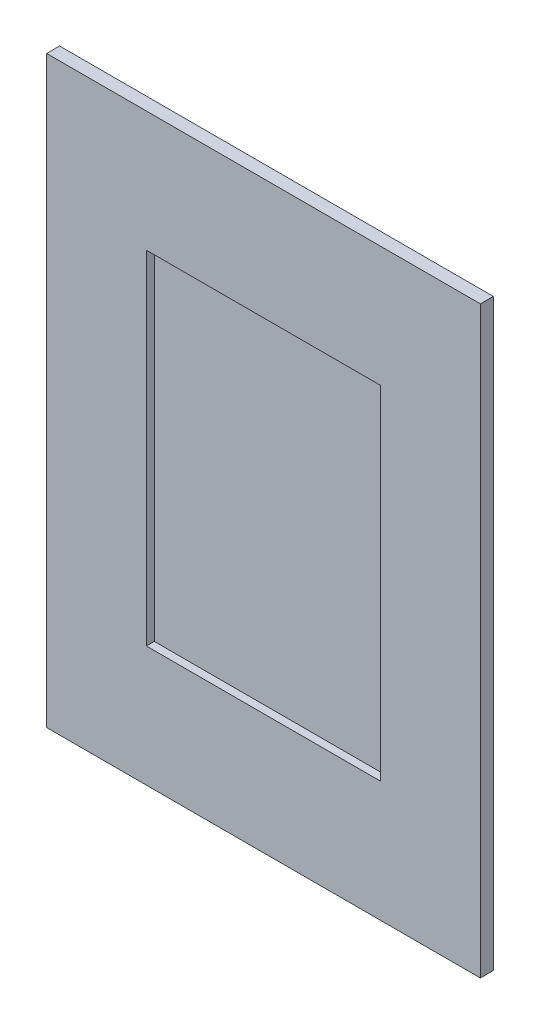
ISO-10303-21;
HEADER;
FILE_DESCRIPTION(('STEP AP214'),'2;1');
FILE_NAME('part.step','',(''),(''),'','','');
FILE_SCHEMA(('AUTOMOTIVE_DESIGN { 1 0 10303 214 1 1 1 1 }'));
ENDSEC;
DATA;
#1=APPLICATION_CONTEXT('core data for automotive mechanical design processes');
#2=APPLICATION_PROTOCOL_DEFINITION('international standard','automotive_design',2000,#1);
#3=PRODUCT_CONTEXT('',#1,'mechanical');
#4=PRODUCT('Part','Part','',(#3));
#5=PRODUCT_RELATED_PRODUCT_CATEGORY('part','',(#4));
#6=PRODUCT_DEFINITION_FORMATION('','',#4);
#7=PRODUCT_DEFINITION_CONTEXT('part definition',#1,'design');
#8=PRODUCT_DEFINITION('design','',#6,#7);
#9=PRODUCT_DEFINITION_SHAPE('','',#8);
#10=(LENGTH_UNIT() NAMED_UNIT(*) SI_UNIT(.MILLI.,.METRE.));
#11=(NAMED_UNIT(*) PLANE_ANGLE_UNIT() SI_UNIT($,.RADIAN.));
#12=(NAMED_UNIT(*) SI_UNIT($,.STERADIAN.) SOLID_ANGLE_UNIT());
#13=UNCERTAINTY_MEASURE_WITH_UNIT(LENGTH_MEASURE(1.E-05),#10,'distance_accuracy_value','');
#14=(GEOMETRIC_REPRESENTATION_CONTEXT(3) GLOBAL_UNCERTAINTY_ASSIGNED_CONTEXT((#13)) GLOBAL_UNIT_ASSIGNED_CONTEXT((#10,
#11,#12)) REPRESENTATION_CONTEXT('',''));
#15=CARTESIAN_POINT('',(0.,0.,0.));
#16=DIRECTION('',(0.,0.,1.));
#17=DIRECTION('',(1.,0.,0.));
#18=AXIS2_PLACEMENT_3D('',#15,#16,#17);
#19=CARTESIAN_POINT('',(-32.9174311926605,24.8623853211009,1.55));
#20=DIRECTION('',(1.,0.,0.));
#21=DIRECTION('',(0.,1.,0.));
#22=AXIS2_PLACEMENT_3D('',#19,#20,#21);
#23=PLANE('',#22);
#24=DIRECTION('',(0.,-1.,0.));
#25=VECTOR('',#24,1.);
#26=CARTESIAN_POINT('',(-32.9174311926605,24.8623853211009,0.));
#27=LINE('',#26,#25);
#28=CARTESIAN_POINT('',(-32.9174311926605,24.8623853211009,0.));
#29=VERTEX_POINT('',#28);
#30=CARTESIAN_POINT('',(-32.9174311926605,-45.1376146788991,0.));
#31=VERTEX_POINT('',#30);
#32=EDGE_CURVE('E158',#29,#31,#27,.T.);
#33=ORIENTED_EDGE('',*,*,#32,.T.);
#34=DIRECTION('',(0.,0.,-1.));
#35=VECTOR('',#34,1.);
#36=CARTESIAN_POINT('',(-32.9174311926605,-45.1376146788991,1.55));
#37=LINE('',#36,#35);
#38=CARTESIAN_POINT('',(-32.9174311926605,-45.1376146788991,1.55));
#39=VERTEX_POINT('',#38);
#40=EDGE_CURVE('E11',#39,#31,#37,.T.);
#41=ORIENTED_EDGE('',*,*,#40,.F.);
#42=DIRECTION('',(0.,-1.,0.));
#43=VECTOR('',#42,1.);
#44=CARTESIAN_POINT('',(-32.9174311926605,24.8623853211009,1.55));
#45=LINE('',#44,#43);
#46=CARTESIAN_POINT('',(-32.9174311926605,24.8623853211009,1.55));
#47=VERTEX_POINT('',#46);
#48=EDGE_CURVE('E164',#47,#39,#45,.T.);
#49=ORIENTED_EDGE('',*,*,#48,.F.);
#50=DIRECTION('',(0.,0.,-1.));
#51=VECTOR('',#50,1.);
#52=CARTESIAN_POINT('',(-32.9174311926605,24.8623853211009,1.55));
#53=LINE('',#52,#51);
#54=EDGE_CURVE('E174',#47,#29,#53,.T.);
#55=ORIENTED_EDGE('',*,*,#54,.T.);
#56=EDGE_LOOP('',(#33,#41,#49,#55));
#57=FACE_BOUND('',#56,.T.);
#58=ADVANCED_FACE('F39',(#57),#23,.F.);
#59=CARTESIAN_POINT('',(-32.9174311926605,-45.1376146788991,1.55));
#60=DIRECTION('',(0.,1.,0.));
#61=DIRECTION('',(0.,0.,1.));
#62=AXIS2_PLACEMENT_3D('',#59,#60,#61);
#63=PLANE('',#62);
#64=DIRECTION('',(1.,0.,0.));
#65=VECTOR('',#64,1.);
#66=CARTESIAN_POINT('',(-32.9174311926605,-45.1376146788991,0.));
#67=LINE('',#66,#65);
#68=CARTESIAN_POINT('',(19.0825688073395,-45.1376146788991,0.));
#69=VERTEX_POINT('',#68);
#70=EDGE_CURVE('E178',#31,#69,#67,.T.);
#71=ORIENTED_EDGE('',*,*,#70,.T.);
#72=DIRECTION('',(0.,0.,-1.));
#73=VECTOR('',#72,1.);
#74=CARTESIAN_POINT('',(19.0825688073395,-45.1376146788991,1.55));
#75=LINE('',#74,#73);
#76=CARTESIAN_POINT('',(19.0825688073395,-45.1376146788991,1.55));
#77=VERTEX_POINT('',#76);
#78=EDGE_CURVE('E47',#77,#69,#75,.T.);
#79=ORIENTED_EDGE('',*,*,#78,.F.);
#80=DIRECTION('',(1.,0.,0.));
#81=VECTOR('',#80,1.);
#82=CARTESIAN_POINT('',(-32.9174311926605,-45.1376146788991,1.55));
#83=LINE('',#82,#81);
#84=EDGE_CURVE('E91',#39,#77,#83,.T.);
#85=ORIENTED_EDGE('',*,*,#84,.F.);
#86=ORIENTED_EDGE('',*,*,#40,.T.);
#87=EDGE_LOOP('',(#71,#79,#85,#86));
#88=FACE_BOUND('',#87,.T.);
#89=ADVANCED_FACE('F213',(#88),#63,.F.);
#90=CARTESIAN_POINT('',(19.0825688073395,24.8623853211009,1.55));
#91=DIRECTION('',(-1.,0.,0.));
#92=DIRECTION('',(0.,-1.,0.));
#93=AXIS2_PLACEMENT_3D('',#90,#91,#92);
#94=PLANE('',#93);
#95=DIRECTION('',(0.,1.,0.));
#96=VECTOR('',#95,1.);
#97=CARTESIAN_POINT('',(19.0825688073395,24.8623853211009,0.));
#98=LINE('',#97,#96);
#99=CARTESIAN_POINT('',(19.0825688073395,24.8623853211009,0.));
#100=VERTEX_POINT('',#99);
#101=EDGE_CURVE('E181',#69,#100,#98,.T.);
#102=ORIENTED_EDGE('',*,*,#101,.T.);
#103=DIRECTION('',(0.,0.,-1.));
#104=VECTOR('',#103,1.);
#105=CARTESIAN_POINT('',(19.0825688073395,24.8623853211009,1.55));
#106=LINE('',#105,#104);
#107=CARTESIAN_POINT('',(19.0825688073395,24.8623853211009,1.55));
#108=VERTEX_POINT('',#107);
#109=EDGE_CURVE('E188',#108,#100,#106,.T.);
#110=ORIENTED_EDGE('',*,*,#109,.F.);
#111=DIRECTION('',(0.,1.,0.));
#112=VECTOR('',#111,1.);
#113=CARTESIAN_POINT('',(19.0825688073395,24.8623853211009,1.55));
#114=LINE('',#113,#112);
#115=EDGE_CURVE('E169',#77,#108,#114,.T.);
#116=ORIENTED_EDGE('',*,*,#115,.F.);
#117=ORIENTED_EDGE('',*,*,#78,.T.);
#118=EDGE_LOOP('',(#102,#110,#116,#117));
#119=FACE_BOUND('',#118,.T.);
#120=ADVANCED_FACE('F195',(#119),#94,.F.);
#121=CARTESIAN_POINT('',(-32.9174311926605,24.8623853211009,1.55));
#122=DIRECTION('',(0.,-1.,0.));
#123=DIRECTION('',(0.,0.,-1.));
#124=AXIS2_PLACEMENT_3D('',#121,#122,#123);
#125=PLANE('',#124);
#126=DIRECTION('',(-1.,0.,0.));
#127=VECTOR('',#126,1.);
#128=CARTESIAN_POINT('',(-32.9174311926605,24.8623853211009,0.));
#129=LINE('',#128,#127);
#130=EDGE_CURVE('E84',#100,#29,#129,.T.);
#131=ORIENTED_EDGE('',*,*,#130,.T.);
#132=ORIENTED_EDGE('',*,*,#54,.F.);
#133=DIRECTION('',(-1.,0.,0.));
#134=VECTOR('',#133,1.);
#135=CARTESIAN_POINT('',(-32.9174311926605,24.8623853211009,1.55));
#136=LINE('',#135,#134);
#137=EDGE_CURVE('E63',#108,#47,#136,.T.);
#138=ORIENTED_EDGE('',*,*,#137,.F.);
#139=ORIENTED_EDGE('',*,*,#109,.T.);
#140=EDGE_LOOP('',(#131,#132,#138,#139));
#141=FACE_BOUND('',#140,.T.);
#142=ADVANCED_FACE('F203',(#141),#125,.F.);
#143=CARTESIAN_POINT('',(0.,0.,1.55));
#144=DIRECTION('',(0.,0.,1.));
#145=DIRECTION('',(1.,0.,0.));
#146=AXIS2_PLACEMENT_3D('',#143,#144,#145);
#147=PLANE('',#146);
#148=DIRECTION('',(0.,-1.,0.));
#149=VECTOR('',#148,1.);
#150=CARTESIAN_POINT('',(-20.9674311926605,10.4123853211009,1.55));
#151=LINE('',#150,#149);
#152=CARTESIAN_POINT('',(-20.9674311926605,10.4123853211009,1.55));
#153=VERTEX_POINT('',#152);
#154=CARTESIAN_POINT('',(-20.9674311926605,-30.6876146788991,1.55));
#155=VERTEX_POINT('',#154);
#156=EDGE_CURVE('E54',#153,#155,#151,.T.);
#157=ORIENTED_EDGE('',*,*,#156,.F.);
#158=DIRECTION('',(-1.,0.,0.));
#159=VECTOR('',#158,1.);
#160=CARTESIAN_POINT('',(-20.9674311926605,10.4123853211009,1.55));
#161=LINE('',#160,#159);
#162=CARTESIAN_POINT('',(7.13256880733948,10.4123853211009,1.55));
#163=VERTEX_POINT('',#162);
#164=EDGE_CURVE('E136',#163,#153,#161,.T.);
#165=ORIENTED_EDGE('',*,*,#164,.F.);
#166=DIRECTION('',(0.,1.,0.));
#167=VECTOR('',#166,1.);
#168=CARTESIAN_POINT('',(7.13256880733948,10.4123853211009,1.55));
#169=LINE('',#168,#167);
#170=CARTESIAN_POINT('',(7.13256880733949,-30.6876146788991,1.55));
#171=VERTEX_POINT('',#170);
#172=EDGE_CURVE('E140',#171,#163,#169,.T.);
#173=ORIENTED_EDGE('',*,*,#172,.F.);
#174=DIRECTION('',(1.,0.,0.));
#175=VECTOR('',#174,1.);
#176=CARTESIAN_POINT('',(-20.9674311926605,-30.6876146788991,1.55));
#177=LINE('',#176,#175);
#178=EDGE_CURVE('E149',#155,#171,#177,.T.);
#179=ORIENTED_EDGE('',*,*,#178,.F.);
#180=EDGE_LOOP('',(#157,#165,#173,#179));
#181=FACE_BOUND('',#180,.T.);
#182=ORIENTED_EDGE('',*,*,#48,.T.);
#183=ORIENTED_EDGE('',*,*,#84,.T.);
#184=ORIENTED_EDGE('',*,*,#115,.T.);
#185=ORIENTED_EDGE('',*,*,#137,.T.);
#186=EDGE_LOOP('',(#182,#183,#184,#185));
#187=FACE_BOUND('',#186,.T.);
#188=ADVANCED_FACE('F205',(#181,#187),#147,.T.);
#189=CARTESIAN_POINT('',(0.,0.,0.));
#190=DIRECTION('',(0.,0.,1.));
#191=DIRECTION('',(1.,0.,0.));
#192=AXIS2_PLACEMENT_3D('',#189,#190,#191);
#193=PLANE('',#192);
#194=ORIENTED_EDGE('',*,*,#32,.F.);
#195=ORIENTED_EDGE('',*,*,#130,.F.);
#196=ORIENTED_EDGE('',*,*,#101,.F.);
#197=ORIENTED_EDGE('',*,*,#70,.F.);
#198=EDGE_LOOP('',(#194,#195,#196,#197));
#199=FACE_BOUND('',#198,.T.);
#200=ADVANCED_FACE('F199',(#199),#193,.F.);
#201=CARTESIAN_POINT('',(-20.9674311926605,10.4123853211009,0.6));
#202=DIRECTION('',(-1.,0.,0.));
#203=DIRECTION('',(0.,-1.,0.));
#204=AXIS2_PLACEMENT_3D('',#201,#202,#203);
#205=PLANE('',#204);
#206=ORIENTED_EDGE('',*,*,#156,.T.);
#207=DIRECTION('',(0.,0.,1.));
#208=VECTOR('',#207,1.);
#209=CARTESIAN_POINT('',(-20.9674311926605,-30.6876146788991,0.6));
#210=LINE('',#209,#208);
#211=CARTESIAN_POINT('',(-20.9674311926605,-30.6876146788991,0.6));
#212=VERTEX_POINT('',#211);
#213=EDGE_CURVE('E111',#212,#155,#210,.T.);
#214=ORIENTED_EDGE('',*,*,#213,.F.);
#215=DIRECTION('',(0.,-1.,0.));
#216=VECTOR('',#215,1.);
#217=CARTESIAN_POINT('',(-20.9674311926605,10.4123853211009,0.6));
#218=LINE('',#217,#216);
#219=CARTESIAN_POINT('',(-20.9674311926605,10.4123853211009,0.6));
#220=VERTEX_POINT('',#219);
#221=EDGE_CURVE('E115',#220,#212,#218,.T.);
#222=ORIENTED_EDGE('',*,*,#221,.F.);
#223=DIRECTION('',(0.,0.,1.));
#224=VECTOR('',#223,1.);
#225=CARTESIAN_POINT('',(-20.9674311926605,10.4123853211009,0.6));
#226=LINE('',#225,#224);
#227=EDGE_CURVE('E155',#220,#153,#226,.T.);
#228=ORIENTED_EDGE('',*,*,#227,.T.);
#229=EDGE_LOOP('',(#206,#214,#222,#228));
#230=FACE_BOUND('',#229,.T.);
#231=ADVANCED_FACE('F113',(#230),#205,.F.);
#232=CARTESIAN_POINT('',(-20.9674311926605,10.4123853211009,0.6));
#233=DIRECTION('',(0.,1.,0.));
#234=DIRECTION('',(0.,0.,1.));
#235=AXIS2_PLACEMENT_3D('',#232,#233,#234);
#236=PLANE('',#235);
#237=ORIENTED_EDGE('',*,*,#164,.T.);
#238=ORIENTED_EDGE('',*,*,#227,.F.);
#239=DIRECTION('',(-1.,0.,0.));
#240=VECTOR('',#239,1.);
#241=CARTESIAN_POINT('',(-20.9674311926605,10.4123853211009,0.6));
#242=LINE('',#241,#240);
#243=CARTESIAN_POINT('',(7.13256880733948,10.4123853211009,0.6));
#244=VERTEX_POINT('',#243);
#245=EDGE_CURVE('E122',#244,#220,#242,.T.);
#246=ORIENTED_EDGE('',*,*,#245,.F.);
#247=DIRECTION('',(0.,0.,1.));
#248=VECTOR('',#247,1.);
#249=CARTESIAN_POINT('',(7.13256880733948,10.4123853211009,0.6));
#250=LINE('',#249,#248);
#251=EDGE_CURVE('E159',#244,#163,#250,.T.);
#252=ORIENTED_EDGE('',*,*,#251,.T.);
#253=EDGE_LOOP('',(#237,#238,#246,#252));
#254=FACE_BOUND('',#253,.T.);
#255=ADVANCED_FACE('F252',(#254),#236,.F.);
#256=CARTESIAN_POINT('',(7.13256880733948,10.4123853211009,0.6));
#257=DIRECTION('',(1.,0.,0.));
#258=DIRECTION('',(0.,1.,0.));
#259=AXIS2_PLACEMENT_3D('',#256,#257,#258);
#260=PLANE('',#259);
#261=ORIENTED_EDGE('',*,*,#172,.T.);
#262=ORIENTED_EDGE('',*,*,#251,.F.);
#263=DIRECTION('',(0.,1.,0.));
#264=VECTOR('',#263,1.);
#265=CARTESIAN_POINT('',(7.13256880733948,10.4123853211009,0.6));
#266=LINE('',#265,#264);
#267=CARTESIAN_POINT('',(7.13256880733949,-30.6876146788991,0.6));
#268=VERTEX_POINT('',#267);
#269=EDGE_CURVE('E131',#268,#244,#266,.T.);
#270=ORIENTED_EDGE('',*,*,#269,.F.);
#271=DIRECTION('',(0.,0.,1.));
#272=VECTOR('',#271,1.);
#273=CARTESIAN_POINT('',(7.13256880733949,-30.6876146788991,0.6));
#274=LINE('',#273,#272);
#275=EDGE_CURVE('E121',#268,#171,#274,.T.);
#276=ORIENTED_EDGE('',*,*,#275,.T.);
#277=EDGE_LOOP('',(#261,#262,#270,#276));
#278=FACE_BOUND('',#277,.T.);
#279=ADVANCED_FACE('F261',(#278),#260,.F.);
#280=CARTESIAN_POINT('',(-20.9674311926605,-30.6876146788991,0.6));
#281=DIRECTION('',(0.,-1.,0.));
#282=DIRECTION('',(0.,0.,-1.));
#283=AXIS2_PLACEMENT_3D('',#280,#281,#282);
#284=PLANE('',#283);
#285=ORIENTED_EDGE('',*,*,#178,.T.);
#286=ORIENTED_EDGE('',*,*,#275,.F.);
#287=DIRECTION('',(1.,0.,0.));
#288=VECTOR('',#287,1.);
#289=CARTESIAN_POINT('',(-20.9674311926605,-30.6876146788991,0.6));
#290=LINE('',#289,#288);
#291=EDGE_CURVE('E125',#212,#268,#290,.T.);
#292=ORIENTED_EDGE('',*,*,#291,.F.);
#293=ORIENTED_EDGE('',*,*,#213,.T.);
#294=EDGE_LOOP('',(#285,#286,#292,#293));
#295=FACE_BOUND('',#294,.T.);
#296=ADVANCED_FACE('F126',(#295),#284,.F.);
#297=CARTESIAN_POINT('',(0.,0.,0.6));
#298=DIRECTION('',(0.,0.,1.));
#299=DIRECTION('',(1.,0.,0.));
#300=AXIS2_PLACEMENT_3D('',#297,#298,#299);
#301=PLANE('',#300);
#302=ORIENTED_EDGE('',*,*,#221,.T.);
#303=ORIENTED_EDGE('',*,*,#291,.T.);
#304=ORIENTED_EDGE('',*,*,#269,.T.);
#305=ORIENTED_EDGE('',*,*,#245,.T.);
#306=EDGE_LOOP('',(#302,#303,#304,#305));
#307=FACE_BOUND('',#306,.T.);
#308=ADVANCED_FACE('F133',(#307),#301,.T.);
#309=CLOSED_SHELL('',(#58,#89,#120,#142,#188,#200,#231,#255,#279,#296,#308));
#310=MANIFOLD_SOLID_BREP('B2',#309);
#311=ADVANCED_BREP_SHAPE_REPRESENTATION('',(#18,#310),#14);
#312=SHAPE_DEFINITION_REPRESENTATION(#9,#311);
ENDSEC;
END-ISO-10303-21;
